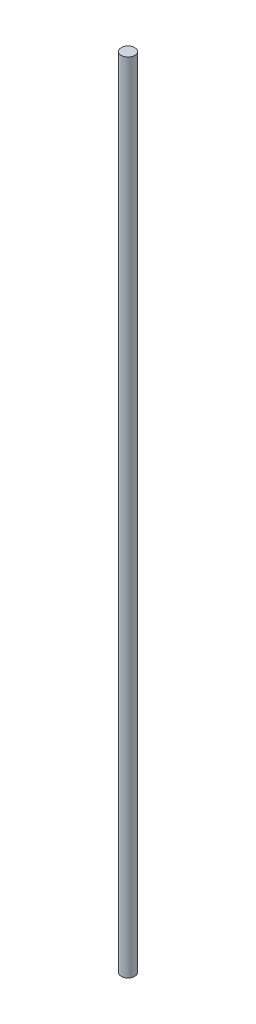
ISO-10303-21;
HEADER;
FILE_DESCRIPTION(('STEP AP214'),'2;1');
FILE_NAME('part.step','',(''),(''),'','','');
FILE_SCHEMA(('AUTOMOTIVE_DESIGN { 1 0 10303 214 1 1 1 1 }'));
ENDSEC;
DATA;
#1=APPLICATION_CONTEXT('core data for automotive mechanical design processes');
#2=APPLICATION_PROTOCOL_DEFINITION('international standard','automotive_design',2000,#1);
#3=PRODUCT_CONTEXT('',#1,'mechanical');
#4=PRODUCT('Part','Part','',(#3));
#5=PRODUCT_RELATED_PRODUCT_CATEGORY('part','',(#4));
#6=PRODUCT_DEFINITION_FORMATION('','',#4);
#7=PRODUCT_DEFINITION_CONTEXT('part definition',#1,'design');
#8=PRODUCT_DEFINITION('design','',#6,#7);
#9=PRODUCT_DEFINITION_SHAPE('','',#8);
#10=(LENGTH_UNIT() NAMED_UNIT(*) SI_UNIT(.MILLI.,.METRE.));
#11=(NAMED_UNIT(*) PLANE_ANGLE_UNIT() SI_UNIT($,.RADIAN.));
#12=(NAMED_UNIT(*) SI_UNIT($,.STERADIAN.) SOLID_ANGLE_UNIT());
#13=UNCERTAINTY_MEASURE_WITH_UNIT(LENGTH_MEASURE(1.E-05),#10,'distance_accuracy_value','');
#14=(GEOMETRIC_REPRESENTATION_CONTEXT(3) GLOBAL_UNCERTAINTY_ASSIGNED_CONTEXT((#13)) GLOBAL_UNIT_ASSIGNED_CONTEXT((#10,
#11,#12)) REPRESENTATION_CONTEXT('',''));
#15=CARTESIAN_POINT('',(0.,0.,0.));
#16=DIRECTION('',(0.,0.,1.));
#17=DIRECTION('',(1.,0.,0.));
#18=AXIS2_PLACEMENT_3D('',#15,#16,#17);
#19=CARTESIAN_POINT('',(0.,235.,0.));
#20=DIRECTION('',(0.,-1.,0.));
#21=DIRECTION('',(0.,0.,-1.));
#22=AXIS2_PLACEMENT_3D('',#19,#20,#21);
#23=CYLINDRICAL_SURFACE('',#22,2.);
#24=CARTESIAN_POINT('',(0.,235.,0.));
#25=DIRECTION('',(0.,1.,0.));
#26=DIRECTION('',(0.,0.,1.));
#27=AXIS2_PLACEMENT_3D('',#24,#25,#26);
#28=CIRCLE('',#27,2.);
#29=CARTESIAN_POINT('',(0.,235.,-2.));
#30=VERTEX_POINT('',#29);
#31=EDGE_CURVE('E10',#30,#30,#28,.T.);
#32=CARTESIAN_POINT('',(0.,0.,0.));
#33=DIRECTION('',(0.,1.,0.));
#34=DIRECTION('',(0.,0.,1.));
#35=AXIS2_PLACEMENT_3D('',#32,#33,#34);
#36=CIRCLE('',#35,2.);
#37=CARTESIAN_POINT('',(0.,0.,-2.));
#38=VERTEX_POINT('',#37);
#39=EDGE_CURVE('E36',#38,#38,#36,.T.);
#40=CARTESIAN_POINT('',(0.,235.,-2.));
#41=CARTESIAN_POINT('',(0.,232.552083333333,-2.));
#42=CARTESIAN_POINT('',(0.,230.104166666667,-2.));
#43=CARTESIAN_POINT('',(0.,225.208333333333,-2.));
#44=CARTESIAN_POINT('',(0.,222.760416666667,-2.));
#45=CARTESIAN_POINT('',(0.,217.864583333333,-2.));
#46=CARTESIAN_POINT('',(0.,215.416666666667,-2.));
#47=CARTESIAN_POINT('',(0.,210.520833333333,-2.));
#48=CARTESIAN_POINT('',(0.,208.072916666667,-2.));
#49=CARTESIAN_POINT('',(0.,203.177083333333,-2.));
#50=CARTESIAN_POINT('',(0.,200.729166666667,-2.));
#51=CARTESIAN_POINT('',(0.,195.833333333333,-2.));
#52=CARTESIAN_POINT('',(0.,193.385416666667,-2.));
#53=CARTESIAN_POINT('',(0.,188.489583333333,-2.));
#54=CARTESIAN_POINT('',(0.,186.041666666667,-2.));
#55=CARTESIAN_POINT('',(0.,181.145833333333,-2.));
#56=CARTESIAN_POINT('',(0.,178.697916666667,-2.));
#57=CARTESIAN_POINT('',(0.,173.802083333333,-2.));
#58=CARTESIAN_POINT('',(0.,171.354166666667,-2.));
#59=CARTESIAN_POINT('',(0.,166.458333333333,-2.));
#60=CARTESIAN_POINT('',(0.,164.010416666667,-2.));
#61=CARTESIAN_POINT('',(0.,159.114583333333,-2.));
#62=CARTESIAN_POINT('',(0.,156.666666666667,-2.));
#63=CARTESIAN_POINT('',(0.,151.770833333333,-2.));
#64=CARTESIAN_POINT('',(0.,149.322916666667,-2.));
#65=CARTESIAN_POINT('',(0.,144.427083333333,-2.));
#66=CARTESIAN_POINT('',(0.,141.979166666667,-2.));
#67=CARTESIAN_POINT('',(0.,137.083333333333,-2.));
#68=CARTESIAN_POINT('',(0.,134.635416666667,-2.));
#69=CARTESIAN_POINT('',(0.,129.739583333333,-2.));
#70=CARTESIAN_POINT('',(0.,127.291666666667,-2.));
#71=CARTESIAN_POINT('',(0.,122.395833333333,-2.));
#72=CARTESIAN_POINT('',(0.,119.947916666667,-2.));
#73=CARTESIAN_POINT('',(0.,115.052083333333,-2.));
#74=CARTESIAN_POINT('',(0.,112.604166666667,-2.));
#75=CARTESIAN_POINT('',(0.,107.708333333333,-2.));
#76=CARTESIAN_POINT('',(0.,105.260416666667,-2.));
#77=CARTESIAN_POINT('',(0.,100.364583333333,-2.));
#78=CARTESIAN_POINT('',(0.,97.9166666666667,-2.));
#79=CARTESIAN_POINT('',(0.,93.0208333333333,-2.));
#80=CARTESIAN_POINT('',(0.,90.5729166666667,-2.));
#81=CARTESIAN_POINT('',(0.,85.6770833333333,-2.));
#82=CARTESIAN_POINT('',(0.,83.2291666666667,-2.));
#83=CARTESIAN_POINT('',(0.,78.3333333333333,-2.));
#84=CARTESIAN_POINT('',(0.,75.8854166666667,-2.));
#85=CARTESIAN_POINT('',(0.,70.9895833333333,-2.));
#86=CARTESIAN_POINT('',(0.,68.5416666666667,-2.));
#87=CARTESIAN_POINT('',(0.,63.6458333333333,-2.));
#88=CARTESIAN_POINT('',(0.,61.1979166666667,-2.));
#89=CARTESIAN_POINT('',(0.,56.3020833333333,-2.));
#90=CARTESIAN_POINT('',(0.,53.8541666666667,-2.));
#91=CARTESIAN_POINT('',(0.,48.9583333333333,-2.));
#92=CARTESIAN_POINT('',(0.,46.5104166666667,-2.));
#93=CARTESIAN_POINT('',(0.,41.6145833333333,-2.));
#94=CARTESIAN_POINT('',(0.,39.1666666666666,-2.));
#95=CARTESIAN_POINT('',(0.,34.2708333333333,-2.));
#96=CARTESIAN_POINT('',(0.,31.8229166666666,-2.));
#97=CARTESIAN_POINT('',(0.,26.9270833333333,-2.));
#98=CARTESIAN_POINT('',(0.,24.4791666666666,-2.));
#99=CARTESIAN_POINT('',(0.,19.5833333333333,-2.));
#100=CARTESIAN_POINT('',(0.,17.1354166666666,-2.));
#101=CARTESIAN_POINT('',(0.,12.2395833333333,-2.));
#102=CARTESIAN_POINT('',(0.,9.79166666666664,-2.));
#103=CARTESIAN_POINT('',(0.,4.89583333333331,-2.));
#104=CARTESIAN_POINT('',(0.,2.44791666666664,-2.));
#105=CARTESIAN_POINT('',(0.,0.,-2.));
#106=B_SPLINE_CURVE_WITH_KNOTS('',3,(#40,#41,#42,#43,#44,#45,#46,#47,#48,#49,#50,#51,#52,#53,
#54,#55,#56,#57,#58,#59,#60,#61,#62,#63,#64,#65,#66,#67,#68,#69,#70,#71,#72,#73,#74,#75,#76,#77,
#78,#79,#80,#81,#82,#83,#84,#85,#86,#87,#88,#89,#90,#91,#92,#93,#94,#95,#96,#97,#98,#99,#100,
#101,#102,#103,#104,#105),.UNSPECIFIED.,.F.,.F.,(4,2,2,2,2,2,2,2,2,2,2,2,2,2,2,2,2,2,2,2,2,2,2,
2,2,2,2,2,2,2,2,2,4),(0.,7.34375000000001,14.6875,22.03125,29.375,36.71875,44.0625,51.40625,
58.75,66.09375,73.4375,80.78125,88.125,95.46875,102.8125,110.15625,117.5,124.84375,132.1875,
139.53125,146.875,154.21875,161.5625,168.90625,176.25,183.59375,190.9375,198.28125,205.625,
212.96875,220.3125,227.65625,235.),.UNSPECIFIED.);
#107=EDGE_CURVE('BSEAM33',#30,#38,#106,.T.);
#108=ORIENTED_EDGE('',*,*,#31,.F.);
#109=ORIENTED_EDGE('',*,*,#39,.T.);
#110=ORIENTED_EDGE('',*,*,#107,.T.);
#111=ORIENTED_EDGE('',*,*,#107,.F.);
#112=EDGE_LOOP('',(#108,#110,#109,#111));
#113=FACE_BOUND('',#112,.T.);
#114=ADVANCED_FACE('F33',(#113),#23,.T.);
#115=CARTESIAN_POINT('',(0.,235.,0.));
#116=DIRECTION('',(0.,1.,0.));
#117=DIRECTION('',(0.,0.,1.));
#118=AXIS2_PLACEMENT_3D('',#115,#116,#117);
#119=PLANE('',#118);
#120=ORIENTED_EDGE('',*,*,#31,.T.);
#121=EDGE_LOOP('',(#120));
#122=FACE_BOUND('',#121,.T.);
#123=ADVANCED_FACE('F48',(#122),#119,.T.);
#124=CARTESIAN_POINT('',(0.,0.,0.));
#125=DIRECTION('',(0.,1.,0.));
#126=DIRECTION('',(0.,0.,1.));
#127=AXIS2_PLACEMENT_3D('',#124,#125,#126);
#128=PLANE('',#127);
#129=ORIENTED_EDGE('',*,*,#39,.F.);
#130=EDGE_LOOP('',(#129));
#131=FACE_BOUND('',#130,.T.);
#132=ADVANCED_FACE('F46',(#131),#128,.F.);
#133=CLOSED_SHELL('',(#114,#123,#132));
#134=MANIFOLD_SOLID_BREP('B2',#133);
#135=ADVANCED_BREP_SHAPE_REPRESENTATION('',(#18,#134),#14);
#136=SHAPE_DEFINITION_REPRESENTATION(#9,#135);
ENDSEC;
END-ISO-10303-21;
